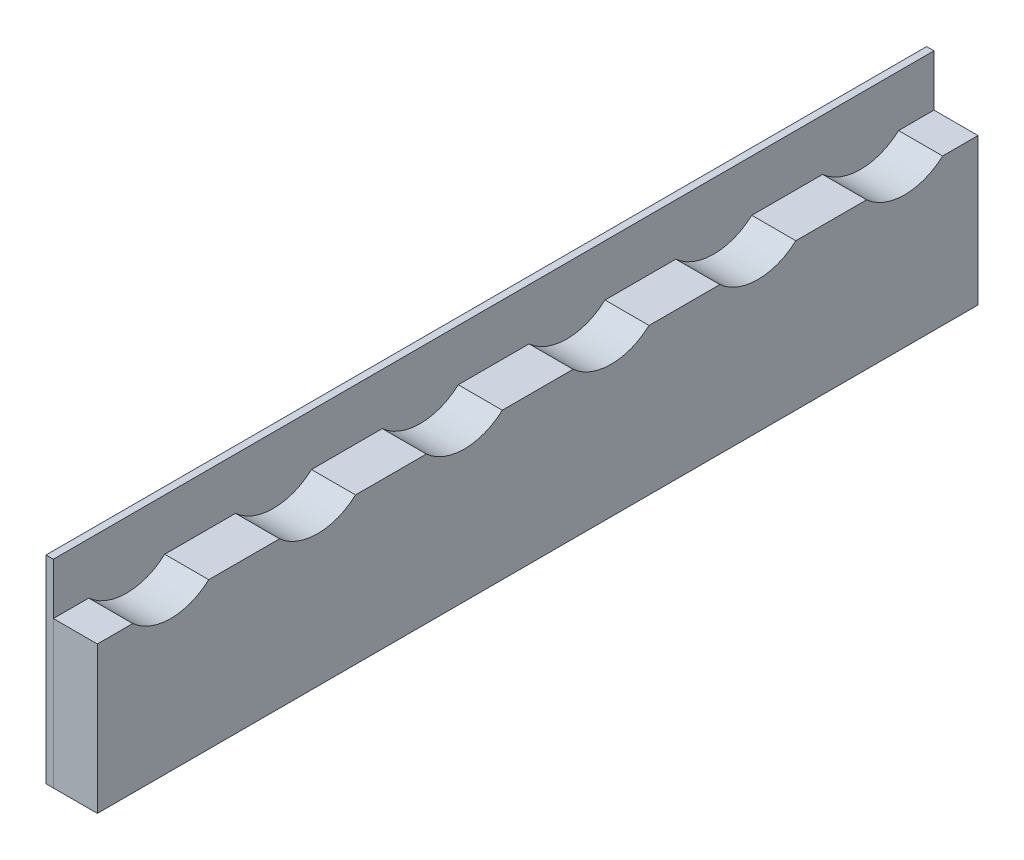
ISO-10303-21;
HEADER;
FILE_DESCRIPTION(('STEP AP214'),'2;1');
FILE_NAME('part.step','',(''),(''),'','','');
FILE_SCHEMA(('AUTOMOTIVE_DESIGN { 1 0 10303 214 1 1 1 1 }'));
ENDSEC;
DATA;
#1=APPLICATION_CONTEXT('core data for automotive mechanical design processes');
#2=APPLICATION_PROTOCOL_DEFINITION('international standard','automotive_design',2000,#1);
#3=PRODUCT_CONTEXT('',#1,'mechanical');
#4=PRODUCT('Part','Part','',(#3));
#5=PRODUCT_RELATED_PRODUCT_CATEGORY('part','',(#4));
#6=PRODUCT_DEFINITION_FORMATION('','',#4);
#7=PRODUCT_DEFINITION_CONTEXT('part definition',#1,'design');
#8=PRODUCT_DEFINITION('design','',#6,#7);
#9=PRODUCT_DEFINITION_SHAPE('','',#8);
#10=(LENGTH_UNIT() NAMED_UNIT(*) SI_UNIT(.MILLI.,.METRE.));
#11=(NAMED_UNIT(*) PLANE_ANGLE_UNIT() SI_UNIT($,.RADIAN.));
#12=(NAMED_UNIT(*) SI_UNIT($,.STERADIAN.) SOLID_ANGLE_UNIT());
#13=UNCERTAINTY_MEASURE_WITH_UNIT(LENGTH_MEASURE(1.E-05),#10,'distance_accuracy_value','');
#14=(GEOMETRIC_REPRESENTATION_CONTEXT(3) GLOBAL_UNCERTAINTY_ASSIGNED_CONTEXT((#13)) GLOBAL_UNIT_ASSIGNED_CONTEXT((#10,
#11,#12)) REPRESENTATION_CONTEXT('',''));
#15=CARTESIAN_POINT('',(0.,0.,0.));
#16=DIRECTION('',(0.,0.,1.));
#17=DIRECTION('',(1.,0.,0.));
#18=AXIS2_PLACEMENT_3D('',#15,#16,#17);
#19=CARTESIAN_POINT('',(-8.01,100.01,0.));
#20=DIRECTION('',(0.,0.,1.));
#21=DIRECTION('',(0.,-1.,0.));
#22=AXIS2_PLACEMENT_3D('',#19,#20,#21);
#23=PLANE('',#22);
#24=DIRECTION('',(1.,0.,0.));
#25=VECTOR('',#24,1.);
#26=CARTESIAN_POINT('',(7.,100.,0.));
#27=LINE('',#26,#25);
#28=CARTESIAN_POINT('',(-8.,100.,0.));
#29=VERTEX_POINT('',#28);
#30=CARTESIAN_POINT('',(22.,100.,0.));
#31=VERTEX_POINT('',#30);
#32=EDGE_CURVE('P0_E94',#29,#31,#27,.T.);
#33=ORIENTED_EDGE('',*,*,#32,.F.);
#34=DIRECTION('',(0.,1.,0.));
#35=VECTOR('',#34,1.);
#36=CARTESIAN_POINT('',(-8.,50.,0.));
#37=LINE('',#36,#35);
#38=CARTESIAN_POINT('',(-8.,0.,0.));
#39=VERTEX_POINT('',#38);
#40=EDGE_CURVE('P0_E196',#39,#29,#37,.T.);
#41=ORIENTED_EDGE('',*,*,#40,.F.);
#42=DIRECTION('',(-1.,0.,0.));
#43=VECTOR('',#42,1.);
#44=CARTESIAN_POINT('',(7.,0.,0.));
#45=LINE('',#44,#43);
#46=CARTESIAN_POINT('',(22.,0.,0.));
#47=VERTEX_POINT('',#46);
#48=EDGE_CURVE('P0_E229',#47,#39,#45,.T.);
#49=ORIENTED_EDGE('',*,*,#48,.F.);
#50=DIRECTION('',(0.,-1.,0.));
#51=VECTOR('',#50,1.);
#52=CARTESIAN_POINT('',(22.,50.,0.));
#53=LINE('',#52,#51);
#54=EDGE_CURVE('P0_E210',#31,#47,#53,.T.);
#55=ORIENTED_EDGE('',*,*,#54,.F.);
#56=EDGE_LOOP('',(#33,#41,#49,#55));
#57=FACE_BOUND('',#56,.T.);
#58=ADVANCED_FACE('P0_F17',(#57),#23,.T.);
#59=CARTESIAN_POINT('',(-8.01,0.,0.0100000000000711));
#60=DIRECTION('',(0.,-1.,0.));
#61=DIRECTION('',(0.,0.,-1.));
#62=AXIS2_PLACEMENT_3D('',#59,#60,#61);
#63=PLANE('',#62);
#64=DIRECTION('',(0.,0.,1.));
#65=VECTOR('',#64,1.);
#66=CARTESIAN_POINT('',(-8.,0.,-300.));
#67=LINE('',#66,#65);
#68=CARTESIAN_POINT('',(-8.,0.,-600.));
#69=VERTEX_POINT('',#68);
#70=EDGE_CURVE('P0_E169',#69,#39,#67,.T.);
#71=ORIENTED_EDGE('',*,*,#70,.F.);
#72=DIRECTION('',(-1.,0.,0.));
#73=VECTOR('',#72,1.);
#74=CARTESIAN_POINT('',(7.,0.,-600.));
#75=LINE('',#74,#73);
#76=CARTESIAN_POINT('',(22.,0.,-600.));
#77=VERTEX_POINT('',#76);
#78=EDGE_CURVE('P0_E205',#77,#69,#75,.T.);
#79=ORIENTED_EDGE('',*,*,#78,.F.);
#80=DIRECTION('',(0.,0.,-1.));
#81=VECTOR('',#80,1.);
#82=CARTESIAN_POINT('',(22.,0.,-300.));
#83=LINE('',#82,#81);
#84=EDGE_CURVE('P0_E213',#47,#77,#83,.T.);
#85=ORIENTED_EDGE('',*,*,#84,.F.);
#86=ORIENTED_EDGE('',*,*,#48,.T.);
#87=EDGE_LOOP('',(#71,#79,#85,#86));
#88=FACE_BOUND('',#87,.T.);
#89=ADVANCED_FACE('P0_F313',(#88),#63,.T.);
#90=CARTESIAN_POINT('',(-8.01,100.,-524.12564178891));
#91=DIRECTION('',(0.,1.,0.));
#92=DIRECTION('',(0.,0.,1.));
#93=AXIS2_PLACEMENT_3D('',#90,#91,#92);
#94=PLANE('',#93);
#95=DIRECTION('',(-1.,0.,0.));
#96=VECTOR('',#95,1.);
#97=CARTESIAN_POINT('',(7.,100.,-475.88435821109));
#98=LINE('',#97,#96);
#99=CARTESIAN_POINT('',(22.,100.,-475.88435821109));
#100=VERTEX_POINT('',#99);
#101=CARTESIAN_POINT('',(-8.,100.,-475.88435821109));
#102=VERTEX_POINT('',#101);
#103=EDGE_CURVE('P0_E129',#100,#102,#98,.T.);
#104=ORIENTED_EDGE('',*,*,#103,.F.);
#105=DIRECTION('',(0.,0.,1.));
#106=VECTOR('',#105,1.);
#107=CARTESIAN_POINT('',(22.,100.,-300.));
#108=LINE('',#107,#106);
#109=CARTESIAN_POINT('',(22.,100.,-524.11564178891));
#110=VERTEX_POINT('',#109);
#111=EDGE_CURVE('P0_E157',#110,#100,#108,.T.);
#112=ORIENTED_EDGE('',*,*,#111,.F.);
#113=DIRECTION('',(1.,0.,0.));
#114=VECTOR('',#113,1.);
#115=CARTESIAN_POINT('',(7.,100.,-524.11564178891));
#116=LINE('',#115,#114);
#117=CARTESIAN_POINT('',(-8.,100.,-524.11564178891));
#118=VERTEX_POINT('',#117);
#119=EDGE_CURVE('P0_E168',#118,#110,#116,.T.);
#120=ORIENTED_EDGE('',*,*,#119,.F.);
#121=DIRECTION('',(0.,0.,-1.));
#122=VECTOR('',#121,1.);
#123=CARTESIAN_POINT('',(-8.,100.,-300.));
#124=LINE('',#123,#122);
#125=EDGE_CURVE('P0_E171',#102,#118,#124,.T.);
#126=ORIENTED_EDGE('',*,*,#125,.F.);
#127=EDGE_LOOP('',(#104,#112,#120,#126));
#128=FACE_BOUND('',#127,.T.);
#129=ADVANCED_FACE('P0_F299',(#128),#94,.T.);
#130=CARTESIAN_POINT('',(22.,128.500000000001,-450.));
#131=DIRECTION('',(-1.,0.,0.));
#132=DIRECTION('',(0.,-1.,0.));
#133=AXIS2_PLACEMENT_3D('',#130,#131,#132);
#134=CYLINDRICAL_SURFACE('',#133,38.5000000000009);
#135=DIRECTION('',(-1.,0.,0.));
#136=VECTOR('',#135,1.);
#137=CARTESIAN_POINT('',(7.,100.,-424.11564178891));
#138=LINE('',#137,#136);
#139=CARTESIAN_POINT('',(22.,100.,-424.11564178891));
#140=VERTEX_POINT('',#139);
#141=CARTESIAN_POINT('',(-8.,100.,-424.11564178891));
#142=VERTEX_POINT('',#141);
#143=EDGE_CURVE('P0_E134',#140,#142,#138,.T.);
#144=ORIENTED_EDGE('',*,*,#143,.F.);
#145=CARTESIAN_POINT('',(22.,128.500000000001,-450.));
#146=DIRECTION('',(-1.,0.,0.));
#147=DIRECTION('',(0.,-1.,0.));
#148=AXIS2_PLACEMENT_3D('',#145,#146,#147);
#149=CIRCLE('',#148,38.5000000000009);
#150=EDGE_CURVE('P0_E138',#100,#140,#149,.T.);
#151=ORIENTED_EDGE('',*,*,#150,.F.);
#152=ORIENTED_EDGE('',*,*,#103,.T.);
#153=CARTESIAN_POINT('',(-8.,128.500000000001,-450.));
#154=DIRECTION('',(-1.,0.,0.));
#155=DIRECTION('',(0.,-1.,0.));
#156=AXIS2_PLACEMENT_3D('',#153,#154,#155);
#157=CIRCLE('',#156,38.5000000000009);
#158=EDGE_CURVE('P0_E141',#142,#102,#157,.F.);
#159=ORIENTED_EDGE('',*,*,#158,.F.);
#160=EDGE_LOOP('',(#144,#151,#152,#159));
#161=FACE_BOUND('',#160,.T.);
#162=ADVANCED_FACE('P0_F136',(#161),#134,.F.);
#163=CARTESIAN_POINT('',(-8.01,100.,-424.12564178891));
#164=DIRECTION('',(0.,1.,0.));
#165=DIRECTION('',(0.,0.,1.));
#166=AXIS2_PLACEMENT_3D('',#163,#164,#165);
#167=PLANE('',#166);
#168=DIRECTION('',(-1.,0.,0.));
#169=VECTOR('',#168,1.);
#170=CARTESIAN_POINT('',(7.,100.,-375.88435821109));
#171=LINE('',#170,#169);
#172=CARTESIAN_POINT('',(22.,100.,-375.88435821109));
#173=VERTEX_POINT('',#172);
#174=CARTESIAN_POINT('',(-8.,100.,-375.88435821109));
#175=VERTEX_POINT('',#174);
#176=EDGE_CURVE('P0_E145',#173,#175,#171,.T.);
#177=ORIENTED_EDGE('',*,*,#176,.F.);
#178=DIRECTION('',(0.,0.,1.));
#179=VECTOR('',#178,1.);
#180=CARTESIAN_POINT('',(22.,100.,-300.));
#181=LINE('',#180,#179);
#182=EDGE_CURVE('P0_E148',#140,#173,#181,.T.);
#183=ORIENTED_EDGE('',*,*,#182,.F.);
#184=ORIENTED_EDGE('',*,*,#143,.T.);
#185=DIRECTION('',(0.,0.,-1.));
#186=VECTOR('',#185,1.);
#187=CARTESIAN_POINT('',(-8.,100.,-300.));
#188=LINE('',#187,#186);
#189=EDGE_CURVE('P0_E172',#175,#142,#188,.T.);
#190=ORIENTED_EDGE('',*,*,#189,.F.);
#191=EDGE_LOOP('',(#177,#183,#184,#190));
#192=FACE_BOUND('',#191,.T.);
#193=ADVANCED_FACE('P0_F149',(#192),#167,.T.);
#194=CARTESIAN_POINT('',(22.,128.500000000001,-350.));
#195=DIRECTION('',(-1.,0.,0.));
#196=DIRECTION('',(0.,-1.,0.));
#197=AXIS2_PLACEMENT_3D('',#194,#195,#196);
#198=CYLINDRICAL_SURFACE('',#197,38.5000000000009);
#199=DIRECTION('',(-1.,0.,0.));
#200=VECTOR('',#199,1.);
#201=CARTESIAN_POINT('',(7.,100.,-324.11564178891));
#202=LINE('',#201,#200);
#203=CARTESIAN_POINT('',(22.,100.,-324.11564178891));
#204=VERTEX_POINT('',#203);
#205=CARTESIAN_POINT('',(-8.,100.,-324.11564178891));
#206=VERTEX_POINT('',#205);
#207=EDGE_CURVE('P0_E225',#204,#206,#202,.T.);
#208=ORIENTED_EDGE('',*,*,#207,.F.);
#209=CARTESIAN_POINT('',(22.,128.500000000001,-350.));
#210=DIRECTION('',(-1.,0.,0.));
#211=DIRECTION('',(0.,-1.,0.));
#212=AXIS2_PLACEMENT_3D('',#209,#210,#211);
#213=CIRCLE('',#212,38.5000000000009);
#214=EDGE_CURVE('P0_E153',#173,#204,#213,.T.);
#215=ORIENTED_EDGE('',*,*,#214,.F.);
#216=ORIENTED_EDGE('',*,*,#176,.T.);
#217=CARTESIAN_POINT('',(-8.,128.500000000001,-350.));
#218=DIRECTION('',(-1.,0.,0.));
#219=DIRECTION('',(0.,-1.,0.));
#220=AXIS2_PLACEMENT_3D('',#217,#218,#219);
#221=CIRCLE('',#220,38.5000000000009);
#222=EDGE_CURVE('P0_E173',#206,#175,#221,.F.);
#223=ORIENTED_EDGE('',*,*,#222,.F.);
#224=EDGE_LOOP('',(#208,#215,#216,#223));
#225=FACE_BOUND('',#224,.T.);
#226=ADVANCED_FACE('P0_F296',(#225),#198,.F.);
#227=CARTESIAN_POINT('',(-8.01,100.,-324.12564178891));
#228=DIRECTION('',(0.,1.,0.));
#229=DIRECTION('',(0.,0.,1.));
#230=AXIS2_PLACEMENT_3D('',#227,#228,#229);
#231=PLANE('',#230);
#232=ORIENTED_EDGE('',*,*,#207,.T.);
#233=DIRECTION('',(0.,0.,-1.));
#234=VECTOR('',#233,1.);
#235=CARTESIAN_POINT('',(-8.,100.,-300.));
#236=LINE('',#235,#234);
#237=CARTESIAN_POINT('',(-8.,100.,-275.88435821109));
#238=VERTEX_POINT('',#237);
#239=EDGE_CURVE('P0_E176',#238,#206,#236,.T.);
#240=ORIENTED_EDGE('',*,*,#239,.F.);
#241=DIRECTION('',(-1.,0.,0.));
#242=VECTOR('',#241,1.);
#243=CARTESIAN_POINT('',(7.,100.,-275.88435821109));
#244=LINE('',#243,#242);
#245=CARTESIAN_POINT('',(22.,100.,-275.88435821109));
#246=VERTEX_POINT('',#245);
#247=EDGE_CURVE('P0_E223',#246,#238,#244,.T.);
#248=ORIENTED_EDGE('',*,*,#247,.F.);
#249=DIRECTION('',(0.,0.,1.));
#250=VECTOR('',#249,1.);
#251=CARTESIAN_POINT('',(22.,100.,-300.));
#252=LINE('',#251,#250);
#253=EDGE_CURVE('P0_E260',#204,#246,#252,.T.);
#254=ORIENTED_EDGE('',*,*,#253,.F.);
#255=EDGE_LOOP('',(#232,#240,#248,#254));
#256=FACE_BOUND('',#255,.T.);
#257=ADVANCED_FACE('P0_F294',(#256),#231,.T.);
#258=CARTESIAN_POINT('',(-8.,128.500000000001,-250.));
#259=DIRECTION('',(1.,0.,0.));
#260=DIRECTION('',(0.,0.,-1.));
#261=AXIS2_PLACEMENT_3D('',#258,#259,#260);
#262=CYLINDRICAL_SURFACE('',#261,38.5000000000009);
#263=ORIENTED_EDGE('',*,*,#247,.T.);
#264=CARTESIAN_POINT('',(-8.,128.500000000001,-250.));
#265=DIRECTION('',(1.,0.,0.));
#266=DIRECTION('',(0.,0.,-1.));
#267=AXIS2_PLACEMENT_3D('',#264,#265,#266);
#268=CIRCLE('',#267,38.5000000000009);
#269=CARTESIAN_POINT('',(-8.,100.,-224.11564178891));
#270=VERTEX_POINT('',#269);
#271=EDGE_CURVE('P0_E177',#270,#238,#268,.T.);
#272=ORIENTED_EDGE('',*,*,#271,.F.);
#273=DIRECTION('',(-1.,0.,0.));
#274=VECTOR('',#273,1.);
#275=CARTESIAN_POINT('',(7.,100.,-224.11564178891));
#276=LINE('',#275,#274);
#277=CARTESIAN_POINT('',(22.,100.,-224.11564178891));
#278=VERTEX_POINT('',#277);
#279=EDGE_CURVE('P0_E221',#278,#270,#276,.T.);
#280=ORIENTED_EDGE('',*,*,#279,.F.);
#281=CARTESIAN_POINT('',(22.,128.500000000001,-250.));
#282=DIRECTION('',(1.,0.,0.));
#283=DIRECTION('',(0.,0.,-1.));
#284=AXIS2_PLACEMENT_3D('',#281,#282,#283);
#285=CIRCLE('',#284,38.5000000000009);
#286=EDGE_CURVE('P0_E258',#246,#278,#285,.F.);
#287=ORIENTED_EDGE('',*,*,#286,.F.);
#288=EDGE_LOOP('',(#263,#272,#280,#287));
#289=FACE_BOUND('',#288,.T.);
#290=ADVANCED_FACE('P0_F332',(#289),#262,.F.);
#291=CARTESIAN_POINT('',(-8.01,100.,-224.12564178891));
#292=DIRECTION('',(0.,1.,0.));
#293=DIRECTION('',(0.,0.,1.));
#294=AXIS2_PLACEMENT_3D('',#291,#292,#293);
#295=PLANE('',#294);
#296=ORIENTED_EDGE('',*,*,#279,.T.);
#297=DIRECTION('',(0.,0.,-1.));
#298=VECTOR('',#297,1.);
#299=CARTESIAN_POINT('',(-8.,100.,-300.));
#300=LINE('',#299,#298);
#301=CARTESIAN_POINT('',(-8.,100.,-175.88435821109));
#302=VERTEX_POINT('',#301);
#303=EDGE_CURVE('P0_E179',#302,#270,#300,.T.);
#304=ORIENTED_EDGE('',*,*,#303,.F.);
#305=DIRECTION('',(-1.,0.,0.));
#306=VECTOR('',#305,1.);
#307=CARTESIAN_POINT('',(7.,100.,-175.88435821109));
#308=LINE('',#307,#306);
#309=CARTESIAN_POINT('',(22.,100.,-175.88435821109));
#310=VERTEX_POINT('',#309);
#311=EDGE_CURVE('P0_E219',#310,#302,#308,.T.);
#312=ORIENTED_EDGE('',*,*,#311,.F.);
#313=DIRECTION('',(0.,0.,1.));
#314=VECTOR('',#313,1.);
#315=CARTESIAN_POINT('',(22.,100.,-300.));
#316=LINE('',#315,#314);
#317=EDGE_CURVE('P0_E257',#278,#310,#316,.T.);
#318=ORIENTED_EDGE('',*,*,#317,.F.);
#319=EDGE_LOOP('',(#296,#304,#312,#318));
#320=FACE_BOUND('',#319,.T.);
#321=ADVANCED_FACE('P0_F330',(#320),#295,.T.);
#322=CARTESIAN_POINT('',(-8.,128.500000000001,-150.));
#323=DIRECTION('',(1.,0.,0.));
#324=DIRECTION('',(0.,0.,-1.));
#325=AXIS2_PLACEMENT_3D('',#322,#323,#324);
#326=CYLINDRICAL_SURFACE('',#325,38.500000000001);
#327=ORIENTED_EDGE('',*,*,#311,.T.);
#328=CARTESIAN_POINT('',(-8.,128.500000000001,-150.));
#329=DIRECTION('',(1.,0.,0.));
#330=DIRECTION('',(0.,0.,-1.));
#331=AXIS2_PLACEMENT_3D('',#328,#329,#330);
#332=CIRCLE('',#331,38.500000000001);
#333=CARTESIAN_POINT('',(-8.,100.,-124.11564178891));
#334=VERTEX_POINT('',#333);
#335=EDGE_CURVE('P0_E180',#334,#302,#332,.T.);
#336=ORIENTED_EDGE('',*,*,#335,.F.);
#337=DIRECTION('',(-1.,0.,0.));
#338=VECTOR('',#337,1.);
#339=CARTESIAN_POINT('',(7.,100.,-124.11564178891));
#340=LINE('',#339,#338);
#341=CARTESIAN_POINT('',(22.,100.,-124.11564178891));
#342=VERTEX_POINT('',#341);
#343=EDGE_CURVE('P0_E217',#342,#334,#340,.T.);
#344=ORIENTED_EDGE('',*,*,#343,.F.);
#345=CARTESIAN_POINT('',(22.,128.500000000001,-150.));
#346=DIRECTION('',(1.,0.,0.));
#347=DIRECTION('',(0.,0.,-1.));
#348=AXIS2_PLACEMENT_3D('',#345,#346,#347);
#349=CIRCLE('',#348,38.500000000001);
#350=EDGE_CURVE('P0_E255',#310,#342,#349,.F.);
#351=ORIENTED_EDGE('',*,*,#350,.F.);
#352=EDGE_LOOP('',(#327,#336,#344,#351));
#353=FACE_BOUND('',#352,.T.);
#354=ADVANCED_FACE('P0_F326',(#353),#326,.F.);
#355=CARTESIAN_POINT('',(-8.01,100.,-124.12564178891));
#356=DIRECTION('',(0.,1.,0.));
#357=DIRECTION('',(0.,0.,1.));
#358=AXIS2_PLACEMENT_3D('',#355,#356,#357);
#359=PLANE('',#358);
#360=ORIENTED_EDGE('',*,*,#343,.T.);
#361=DIRECTION('',(0.,0.,-1.));
#362=VECTOR('',#361,1.);
#363=CARTESIAN_POINT('',(-8.,100.,-300.));
#364=LINE('',#363,#362);
#365=CARTESIAN_POINT('',(-8.,100.,-75.8843582110896));
#366=VERTEX_POINT('',#365);
#367=EDGE_CURVE('P0_E182',#366,#334,#364,.T.);
#368=ORIENTED_EDGE('',*,*,#367,.F.);
#369=DIRECTION('',(-1.,0.,0.));
#370=VECTOR('',#369,1.);
#371=CARTESIAN_POINT('',(7.,100.,-75.8843582110896));
#372=LINE('',#371,#370);
#373=CARTESIAN_POINT('',(22.,100.,-75.8843582110896));
#374=VERTEX_POINT('',#373);
#375=EDGE_CURVE('P0_E207',#374,#366,#372,.T.);
#376=ORIENTED_EDGE('',*,*,#375,.F.);
#377=DIRECTION('',(0.,0.,1.));
#378=VECTOR('',#377,1.);
#379=CARTESIAN_POINT('',(22.,100.,-300.));
#380=LINE('',#379,#378);
#381=EDGE_CURVE('P0_E254',#342,#374,#380,.T.);
#382=ORIENTED_EDGE('',*,*,#381,.F.);
#383=EDGE_LOOP('',(#360,#368,#376,#382));
#384=FACE_BOUND('',#383,.T.);
#385=ADVANCED_FACE('P0_F323',(#384),#359,.T.);
#386=CARTESIAN_POINT('',(-8.,128.5,-50.));
#387=DIRECTION('',(1.,0.,0.));
#388=DIRECTION('',(0.,0.,-1.));
#389=AXIS2_PLACEMENT_3D('',#386,#387,#388);
#390=CYLINDRICAL_SURFACE('',#389,38.5000000000001);
#391=ORIENTED_EDGE('',*,*,#375,.T.);
#392=CARTESIAN_POINT('',(-8.,128.5,-50.));
#393=DIRECTION('',(1.,0.,0.));
#394=DIRECTION('',(0.,0.,-1.));
#395=AXIS2_PLACEMENT_3D('',#392,#393,#394);
#396=CIRCLE('',#395,38.5000000000001);
#397=CARTESIAN_POINT('',(-8.,100.,-24.1156417889104));
#398=VERTEX_POINT('',#397);
#399=EDGE_CURVE('P0_E21',#398,#366,#396,.T.);
#400=ORIENTED_EDGE('',*,*,#399,.F.);
#401=DIRECTION('',(-1.,0.,0.));
#402=VECTOR('',#401,1.);
#403=CARTESIAN_POINT('',(7.,100.,-24.1156417889104));
#404=LINE('',#403,#402);
#405=CARTESIAN_POINT('',(22.,100.,-24.1156417889104));
#406=VERTEX_POINT('',#405);
#407=EDGE_CURVE('P0_E84',#406,#398,#404,.T.);
#408=ORIENTED_EDGE('',*,*,#407,.F.);
#409=CARTESIAN_POINT('',(22.,128.5,-50.));
#410=DIRECTION('',(1.,0.,0.));
#411=DIRECTION('',(0.,0.,-1.));
#412=AXIS2_PLACEMENT_3D('',#409,#410,#411);
#413=CIRCLE('',#412,38.5000000000001);
#414=EDGE_CURVE('P0_E251',#374,#406,#413,.F.);
#415=ORIENTED_EDGE('',*,*,#414,.F.);
#416=EDGE_LOOP('',(#391,#400,#408,#415));
#417=FACE_BOUND('',#416,.T.);
#418=ADVANCED_FACE('P0_F318',(#417),#390,.F.);
#419=CARTESIAN_POINT('',(-8.01,100.,-24.1256417889104));
#420=DIRECTION('',(0.,1.,0.));
#421=DIRECTION('',(0.,0.,1.));
#422=AXIS2_PLACEMENT_3D('',#419,#420,#421);
#423=PLANE('',#422);
#424=ORIENTED_EDGE('',*,*,#407,.T.);
#425=DIRECTION('',(0.,0.,-1.));
#426=VECTOR('',#425,1.);
#427=CARTESIAN_POINT('',(-8.,100.,-300.));
#428=LINE('',#427,#426);
#429=EDGE_CURVE('P0_E191',#29,#398,#428,.T.);
#430=ORIENTED_EDGE('',*,*,#429,.F.);
#431=ORIENTED_EDGE('',*,*,#32,.T.);
#432=DIRECTION('',(0.,0.,1.));
#433=VECTOR('',#432,1.);
#434=CARTESIAN_POINT('',(22.,100.,-300.));
#435=LINE('',#434,#433);
#436=EDGE_CURVE('P0_E253',#406,#31,#435,.T.);
#437=ORIENTED_EDGE('',*,*,#436,.F.);
#438=EDGE_LOOP('',(#424,#430,#431,#437));
#439=FACE_BOUND('',#438,.T.);
#440=ADVANCED_FACE('P0_F316',(#439),#423,.T.);
#441=CARTESIAN_POINT('',(-8.01,-0.00999999999999446,-600.));
#442=DIRECTION('',(0.,0.,-1.));
#443=DIRECTION('',(0.,1.,0.));
#444=AXIS2_PLACEMENT_3D('',#441,#442,#443);
#445=PLANE('',#444);
#446=DIRECTION('',(-1.,0.,0.));
#447=VECTOR('',#446,1.);
#448=CARTESIAN_POINT('',(7.,100.,-600.));
#449=LINE('',#448,#447);
#450=CARTESIAN_POINT('',(22.,100.,-600.));
#451=VERTEX_POINT('',#450);
#452=CARTESIAN_POINT('',(-8.,100.,-600.));
#453=VERTEX_POINT('',#452);
#454=EDGE_CURVE('P0_E278',#451,#453,#449,.T.);
#455=ORIENTED_EDGE('',*,*,#454,.F.);
#456=DIRECTION('',(0.,1.,0.));
#457=VECTOR('',#456,1.);
#458=CARTESIAN_POINT('',(22.,50.,-600.));
#459=LINE('',#458,#457);
#460=EDGE_CURVE('P0_E164',#77,#451,#459,.T.);
#461=ORIENTED_EDGE('',*,*,#460,.F.);
#462=ORIENTED_EDGE('',*,*,#78,.T.);
#463=DIRECTION('',(0.,-1.,0.));
#464=VECTOR('',#463,1.);
#465=CARTESIAN_POINT('',(-8.,50.,-600.));
#466=LINE('',#465,#464);
#467=EDGE_CURVE('P0_E199',#453,#69,#466,.T.);
#468=ORIENTED_EDGE('',*,*,#467,.F.);
#469=EDGE_LOOP('',(#455,#461,#462,#468));
#470=FACE_BOUND('',#469,.T.);
#471=ADVANCED_FACE('P0_F314',(#470),#445,.T.);
#472=CARTESIAN_POINT('',(-8.,-0.0100000000000033,-600.01));
#473=DIRECTION('',(-1.,0.,0.));
#474=DIRECTION('',(0.,0.,1.));
#475=AXIS2_PLACEMENT_3D('',#472,#473,#474);
#476=PLANE('',#475);
#477=ORIENTED_EDGE('',*,*,#467,.T.);
#478=ORIENTED_EDGE('',*,*,#70,.T.);
#479=ORIENTED_EDGE('',*,*,#40,.T.);
#480=ORIENTED_EDGE('',*,*,#429,.T.);
#481=ORIENTED_EDGE('',*,*,#399,.T.);
#482=ORIENTED_EDGE('',*,*,#367,.T.);
#483=ORIENTED_EDGE('',*,*,#335,.T.);
#484=ORIENTED_EDGE('',*,*,#303,.T.);
#485=ORIENTED_EDGE('',*,*,#271,.T.);
#486=ORIENTED_EDGE('',*,*,#239,.T.);
#487=ORIENTED_EDGE('',*,*,#222,.T.);
#488=ORIENTED_EDGE('',*,*,#189,.T.);
#489=ORIENTED_EDGE('',*,*,#158,.T.);
#490=ORIENTED_EDGE('',*,*,#125,.T.);
#491=CARTESIAN_POINT('',(-8.,128.500000000001,-550.));
#492=DIRECTION('',(-1.,0.,0.));
#493=DIRECTION('',(0.,-1.,0.));
#494=AXIS2_PLACEMENT_3D('',#491,#492,#493);
#495=CIRCLE('',#494,38.5000000000012);
#496=CARTESIAN_POINT('',(-8.,100.,-575.88435821109));
#497=VERTEX_POINT('',#496);
#498=EDGE_CURVE('P0_E165',#497,#118,#495,.T.);
#499=ORIENTED_EDGE('',*,*,#498,.F.);
#500=DIRECTION('',(0.,0.,1.));
#501=VECTOR('',#500,1.);
#502=CARTESIAN_POINT('',(-8.,100.,-587.942179105545));
#503=LINE('',#502,#501);
#504=EDGE_CURVE('P0_E270',#453,#497,#503,.T.);
#505=ORIENTED_EDGE('',*,*,#504,.F.);
#506=EDGE_LOOP('',(#477,#478,#479,#480,#481,#482,#483,#484,#485,#486,#487,#488,#489,#490,#499,#505));
#507=FACE_BOUND('',#506,.T.);
#508=ADVANCED_FACE('P0_F290',(#507),#476,.T.);
#509=CARTESIAN_POINT('',(22.,128.500000000001,-550.));
#510=DIRECTION('',(-1.,0.,0.));
#511=DIRECTION('',(0.,-1.,0.));
#512=AXIS2_PLACEMENT_3D('',#509,#510,#511);
#513=CYLINDRICAL_SURFACE('',#512,38.5000000000012);
#514=ORIENTED_EDGE('',*,*,#119,.T.);
#515=CARTESIAN_POINT('',(22.,128.500000000001,-550.));
#516=DIRECTION('',(-1.,0.,0.));
#517=DIRECTION('',(0.,-1.,0.));
#518=AXIS2_PLACEMENT_3D('',#515,#516,#517);
#519=CIRCLE('',#518,38.5000000000012);
#520=CARTESIAN_POINT('',(22.,100.,-575.88435821109));
#521=VERTEX_POINT('',#520);
#522=EDGE_CURVE('P0_E36',#521,#110,#519,.T.);
#523=ORIENTED_EDGE('',*,*,#522,.F.);
#524=DIRECTION('',(1.,0.,0.));
#525=VECTOR('',#524,1.);
#526=CARTESIAN_POINT('',(7.,100.,-575.88435821109));
#527=LINE('',#526,#525);
#528=EDGE_CURVE('P0_E27',#497,#521,#527,.T.);
#529=ORIENTED_EDGE('',*,*,#528,.F.);
#530=ORIENTED_EDGE('',*,*,#498,.T.);
#531=EDGE_LOOP('',(#514,#523,#529,#530));
#532=FACE_BOUND('',#531,.T.);
#533=ADVANCED_FACE('P0_F300',(#532),#513,.F.);
#534=CARTESIAN_POINT('',(22.,-0.0100000000000033,0.00999999999999446));
#535=DIRECTION('',(1.,0.,0.));
#536=DIRECTION('',(0.,0.,-1.));
#537=AXIS2_PLACEMENT_3D('',#534,#535,#536);
#538=PLANE('',#537);
#539=ORIENTED_EDGE('',*,*,#414,.T.);
#540=ORIENTED_EDGE('',*,*,#436,.T.);
#541=ORIENTED_EDGE('',*,*,#54,.T.);
#542=ORIENTED_EDGE('',*,*,#84,.T.);
#543=ORIENTED_EDGE('',*,*,#460,.T.);
#544=DIRECTION('',(0.,0.,-1.));
#545=VECTOR('',#544,1.);
#546=CARTESIAN_POINT('',(22.,100.,-587.942179105545));
#547=LINE('',#546,#545);
#548=EDGE_CURVE('P0_E11',#521,#451,#547,.T.);
#549=ORIENTED_EDGE('',*,*,#548,.F.);
#550=ORIENTED_EDGE('',*,*,#522,.T.);
#551=ORIENTED_EDGE('',*,*,#111,.T.);
#552=ORIENTED_EDGE('',*,*,#150,.T.);
#553=ORIENTED_EDGE('',*,*,#182,.T.);
#554=ORIENTED_EDGE('',*,*,#214,.T.);
#555=ORIENTED_EDGE('',*,*,#253,.T.);
#556=ORIENTED_EDGE('',*,*,#286,.T.);
#557=ORIENTED_EDGE('',*,*,#317,.T.);
#558=ORIENTED_EDGE('',*,*,#350,.T.);
#559=ORIENTED_EDGE('',*,*,#381,.T.);
#560=EDGE_LOOP('',(#539,#540,#541,#542,#543,#549,#550,#551,#552,#553,#554,#555,#556,#557,#558,#559));
#561=FACE_BOUND('',#560,.T.);
#562=ADVANCED_FACE('P0_F156',(#561),#538,.T.);
#563=CARTESIAN_POINT('',(-8.01,100.,-600.01));
#564=DIRECTION('',(0.,1.,0.));
#565=DIRECTION('',(0.,0.,1.));
#566=AXIS2_PLACEMENT_3D('',#563,#564,#565);
#567=PLANE('',#566);
#568=ORIENTED_EDGE('',*,*,#528,.T.);
#569=ORIENTED_EDGE('',*,*,#548,.T.);
#570=ORIENTED_EDGE('',*,*,#454,.T.);
#571=ORIENTED_EDGE('',*,*,#504,.T.);
#572=EDGE_LOOP('',(#568,#569,#570,#571));
#573=FACE_BOUND('',#572,.T.);
#574=ADVANCED_FACE('P0_F19',(#573),#567,.T.);
#575=CLOSED_SHELL('',(#58,#89,#129,#162,#193,#226,#257,#290,#321,#354,#385,#418,#440,#471,#508,
#533,#562,#574));
#576=MANIFOLD_SOLID_BREP('P0_B1',#575);
#577=CARTESIAN_POINT('',(-7.99,-0.01,0.));
#578=DIRECTION('',(0.,0.,1.));
#579=DIRECTION('',(0.,1.,0.));
#580=AXIS2_PLACEMENT_3D('',#577,#578,#579);
#581=PLANE('',#580);
#582=DIRECTION('',(0.,1.,0.));
#583=VECTOR('',#582,1.);
#584=CARTESIAN_POINT('',(-13.,67.5,0.));
#585=LINE('',#584,#583);
#586=CARTESIAN_POINT('',(-13.,0.,0.));
#587=VERTEX_POINT('',#586);
#588=CARTESIAN_POINT('',(-13.,135.,0.));
#589=VERTEX_POINT('',#588);
#590=EDGE_CURVE('P1_E56',#587,#589,#585,.T.);
#591=ORIENTED_EDGE('',*,*,#590,.F.);
#592=DIRECTION('',(-1.,0.,0.));
#593=VECTOR('',#592,1.);
#594=CARTESIAN_POINT('',(-10.5,0.,0.));
#595=LINE('',#594,#593);
#596=CARTESIAN_POINT('',(-8.,0.,0.));
#597=VERTEX_POINT('',#596);
#598=EDGE_CURVE('P1_E68',#597,#587,#595,.T.);
#599=ORIENTED_EDGE('',*,*,#598,.F.);
#600=DIRECTION('',(0.,-1.,0.));
#601=VECTOR('',#600,1.);
#602=CARTESIAN_POINT('',(-8.,67.5,0.));
#603=LINE('',#602,#601);
#604=CARTESIAN_POINT('',(-8.,135.,0.));
#605=VERTEX_POINT('',#604);
#606=EDGE_CURVE('P1_E21',#605,#597,#603,.T.);
#607=ORIENTED_EDGE('',*,*,#606,.F.);
#608=DIRECTION('',(1.,0.,0.));
#609=VECTOR('',#608,1.);
#610=CARTESIAN_POINT('',(-10.5,135.,0.));
#611=LINE('',#610,#609);
#612=EDGE_CURVE('P1_E82',#589,#605,#611,.T.);
#613=ORIENTED_EDGE('',*,*,#612,.F.);
#614=EDGE_LOOP('',(#591,#599,#607,#613));
#615=FACE_BOUND('',#614,.T.);
#616=ADVANCED_FACE('P1_F17',(#615),#581,.T.);
#617=CARTESIAN_POINT('',(-8.,-0.0100000000000033,0.00999999999999446));
#618=DIRECTION('',(1.,0.,0.));
#619=DIRECTION('',(0.,0.,-1.));
#620=AXIS2_PLACEMENT_3D('',#617,#618,#619);
#621=PLANE('',#620);
#622=DIRECTION('',(0.,-1.,0.));
#623=VECTOR('',#622,1.);
#624=CARTESIAN_POINT('',(-8.,67.5,-600.));
#625=LINE('',#624,#623);
#626=CARTESIAN_POINT('',(-8.,135.,-600.));
#627=VERTEX_POINT('',#626);
#628=CARTESIAN_POINT('',(-8.,0.,-600.));
#629=VERTEX_POINT('',#628);
#630=EDGE_CURVE('P1_E84',#627,#629,#625,.T.);
#631=ORIENTED_EDGE('',*,*,#630,.F.);
#632=DIRECTION('',(0.,0.,-1.));
#633=VECTOR('',#632,1.);
#634=CARTESIAN_POINT('',(-8.,135.,-300.));
#635=LINE('',#634,#633);
#636=EDGE_CURVE('P1_E66',#605,#627,#635,.T.);
#637=ORIENTED_EDGE('',*,*,#636,.F.);
#638=ORIENTED_EDGE('',*,*,#606,.T.);
#639=DIRECTION('',(0.,0.,1.));
#640=VECTOR('',#639,1.);
#641=CARTESIAN_POINT('',(-8.,0.,-300.));
#642=LINE('',#641,#640);
#643=EDGE_CURVE('P1_E63',#629,#597,#642,.T.);
#644=ORIENTED_EDGE('',*,*,#643,.F.);
#645=EDGE_LOOP('',(#631,#637,#638,#644));
#646=FACE_BOUND('',#645,.T.);
#647=ADVANCED_FACE('P1_F61',(#646),#621,.T.);
#648=CARTESIAN_POINT('',(-7.99,0.,-600.01));
#649=DIRECTION('',(0.,-1.,0.));
#650=DIRECTION('',(0.,0.,1.));
#651=AXIS2_PLACEMENT_3D('',#648,#649,#650);
#652=PLANE('',#651);
#653=DIRECTION('',(0.,0.,1.));
#654=VECTOR('',#653,1.);
#655=CARTESIAN_POINT('',(-13.,0.,-300.));
#656=LINE('',#655,#654);
#657=CARTESIAN_POINT('',(-13.,0.,-600.));
#658=VERTEX_POINT('',#657);
#659=EDGE_CURVE('P1_E78',#658,#587,#656,.T.);
#660=ORIENTED_EDGE('',*,*,#659,.F.);
#661=DIRECTION('',(-1.,0.,0.));
#662=VECTOR('',#661,1.);
#663=CARTESIAN_POINT('',(-10.5,0.,-600.));
#664=LINE('',#663,#662);
#665=EDGE_CURVE('P1_E74',#629,#658,#664,.T.);
#666=ORIENTED_EDGE('',*,*,#665,.F.);
#667=ORIENTED_EDGE('',*,*,#643,.T.);
#668=ORIENTED_EDGE('',*,*,#598,.T.);
#669=EDGE_LOOP('',(#660,#666,#667,#668));
#670=FACE_BOUND('',#669,.T.);
#671=ADVANCED_FACE('P1_F72',(#670),#652,.T.);
#672=CARTESIAN_POINT('',(-13.,-0.0100000000000033,-600.01));
#673=DIRECTION('',(-1.,0.,0.));
#674=DIRECTION('',(0.,0.,1.));
#675=AXIS2_PLACEMENT_3D('',#672,#673,#674);
#676=PLANE('',#675);
#677=DIRECTION('',(0.,1.,0.));
#678=VECTOR('',#677,1.);
#679=CARTESIAN_POINT('',(-13.,67.5,-600.));
#680=LINE('',#679,#678);
#681=CARTESIAN_POINT('',(-13.,135.,-600.));
#682=VERTEX_POINT('',#681);
#683=EDGE_CURVE('P1_E27',#658,#682,#680,.T.);
#684=ORIENTED_EDGE('',*,*,#683,.F.);
#685=ORIENTED_EDGE('',*,*,#659,.T.);
#686=ORIENTED_EDGE('',*,*,#590,.T.);
#687=DIRECTION('',(0.,0.,1.));
#688=VECTOR('',#687,1.);
#689=CARTESIAN_POINT('',(-13.,135.,-300.));
#690=LINE('',#689,#688);
#691=EDGE_CURVE('P1_E36',#682,#589,#690,.T.);
#692=ORIENTED_EDGE('',*,*,#691,.F.);
#693=EDGE_LOOP('',(#684,#685,#686,#692));
#694=FACE_BOUND('',#693,.T.);
#695=ADVANCED_FACE('P1_F89',(#694),#676,.T.);
#696=CARTESIAN_POINT('',(-7.99,135.,0.01));
#697=DIRECTION('',(0.,1.,0.));
#698=DIRECTION('',(0.,0.,-1.));
#699=AXIS2_PLACEMENT_3D('',#696,#697,#698);
#700=PLANE('',#699);
#701=ORIENTED_EDGE('',*,*,#691,.T.);
#702=ORIENTED_EDGE('',*,*,#612,.T.);
#703=ORIENTED_EDGE('',*,*,#636,.T.);
#704=DIRECTION('',(1.,0.,0.));
#705=VECTOR('',#704,1.);
#706=CARTESIAN_POINT('',(-10.5,135.,-600.));
#707=LINE('',#706,#705);
#708=EDGE_CURVE('P1_E11',#682,#627,#707,.T.);
#709=ORIENTED_EDGE('',*,*,#708,.F.);
#710=EDGE_LOOP('',(#701,#702,#703,#709));
#711=FACE_BOUND('',#710,.T.);
#712=ADVANCED_FACE('P1_F91',(#711),#700,.T.);
#713=CARTESIAN_POINT('',(-7.99,135.01,-600.));
#714=DIRECTION('',(0.,0.,-1.));
#715=DIRECTION('',(0.,-1.,0.));
#716=AXIS2_PLACEMENT_3D('',#713,#714,#715);
#717=PLANE('',#716);
#718=ORIENTED_EDGE('',*,*,#683,.T.);
#719=ORIENTED_EDGE('',*,*,#708,.T.);
#720=ORIENTED_EDGE('',*,*,#630,.T.);
#721=ORIENTED_EDGE('',*,*,#665,.T.);
#722=EDGE_LOOP('',(#718,#719,#720,#721));
#723=FACE_BOUND('',#722,.T.);
#724=ADVANCED_FACE('P1_F19',(#723),#717,.T.);
#725=CLOSED_SHELL('',(#616,#647,#671,#695,#712,#724));
#726=MANIFOLD_SOLID_BREP('P1_B1',#725);
#727=ADVANCED_BREP_SHAPE_REPRESENTATION('',(#18,#576,#726),#14);
#728=SHAPE_DEFINITION_REPRESENTATION(#9,#727);
ENDSEC;
END-ISO-10303-21;
